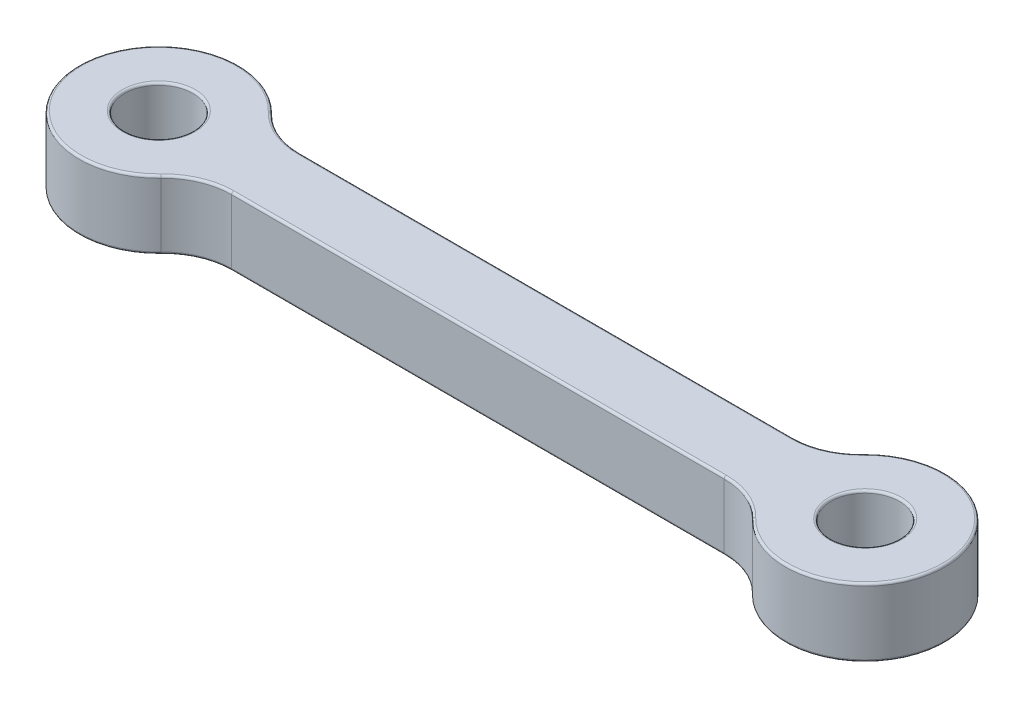
ISO-10303-21;
HEADER;
FILE_DESCRIPTION(('STEP AP214'),'2;1');
FILE_NAME('part.step','',(''),(''),'','','');
FILE_SCHEMA(('AUTOMOTIVE_DESIGN { 1 0 10303 214 1 1 1 1 }'));
ENDSEC;
DATA;
#1=APPLICATION_CONTEXT('core data for automotive mechanical design processes');
#2=APPLICATION_PROTOCOL_DEFINITION('international standard','automotive_design',2000,#1);
#3=PRODUCT_CONTEXT('',#1,'mechanical');
#4=PRODUCT('Part','Part','',(#3));
#5=PRODUCT_RELATED_PRODUCT_CATEGORY('part','',(#4));
#6=PRODUCT_DEFINITION_FORMATION('','',#4);
#7=PRODUCT_DEFINITION_CONTEXT('part definition',#1,'design');
#8=PRODUCT_DEFINITION('design','',#6,#7);
#9=PRODUCT_DEFINITION_SHAPE('','',#8);
#10=(LENGTH_UNIT() NAMED_UNIT(*) SI_UNIT(.MILLI.,.METRE.));
#11=(NAMED_UNIT(*) PLANE_ANGLE_UNIT() SI_UNIT($,.RADIAN.));
#12=(NAMED_UNIT(*) SI_UNIT($,.STERADIAN.) SOLID_ANGLE_UNIT());
#13=UNCERTAINTY_MEASURE_WITH_UNIT(LENGTH_MEASURE(1.E-05),#10,'distance_accuracy_value','');
#14=(GEOMETRIC_REPRESENTATION_CONTEXT(3) GLOBAL_UNCERTAINTY_ASSIGNED_CONTEXT((#13)) GLOBAL_UNIT_ASSIGNED_CONTEXT((#10,
#11,#12)) REPRESENTATION_CONTEXT('',''));
#15=CARTESIAN_POINT('',(0.,0.,0.));
#16=DIRECTION('',(0.,0.,1.));
#17=DIRECTION('',(1.,0.,0.));
#18=AXIS2_PLACEMENT_3D('',#15,#16,#17);
#19=CARTESIAN_POINT('',(0.,3.,-1.5));
#20=DIRECTION('',(0.,0.,-1.));
#21=DIRECTION('',(-1.,0.,0.));
#22=AXIS2_PLACEMENT_3D('',#19,#20,#21);
#23=PLANE('',#22);
#24=DIRECTION('',(0.,-1.,0.));
#25=VECTOR('',#24,1.);
#26=CARTESIAN_POINT('',(26.3095842401766,3.,-1.5));
#27=LINE('',#26,#25);
#28=CARTESIAN_POINT('',(26.3095842401766,2.9,-1.5));
#29=VERTEX_POINT('',#28);
#30=CARTESIAN_POINT('',(26.3095842401766,0.0999999999999998,-1.5));
#31=VERTEX_POINT('',#30);
#32=EDGE_CURVE('E297',#29,#31,#27,.T.);
#33=ORIENTED_EDGE('',*,*,#32,.T.);
#34=DIRECTION('',(1.,0.,0.));
#35=VECTOR('',#34,1.);
#36=CARTESIAN_POINT('',(4.69041575982343,0.1,-1.5));
#37=LINE('',#36,#35);
#38=CARTESIAN_POINT('',(4.69041575982343,0.0999999999999998,-1.5));
#39=VERTEX_POINT('',#38);
#40=EDGE_CURVE('E244',#31,#39,#37,.F.);
#41=ORIENTED_EDGE('',*,*,#40,.T.);
#42=DIRECTION('',(0.,-1.,0.));
#43=VECTOR('',#42,1.);
#44=CARTESIAN_POINT('',(4.69041575982343,3.,-1.5));
#45=LINE('',#44,#43);
#46=CARTESIAN_POINT('',(4.69041575982343,2.9,-1.5));
#47=VERTEX_POINT('',#46);
#48=EDGE_CURVE('E177',#47,#39,#45,.T.);
#49=ORIENTED_EDGE('',*,*,#48,.F.);
#50=DIRECTION('',(1.,0.,0.));
#51=VECTOR('',#50,1.);
#52=CARTESIAN_POINT('',(0.,2.9,-1.5));
#53=LINE('',#52,#51);
#54=EDGE_CURVE('E242',#47,#29,#53,.T.);
#55=ORIENTED_EDGE('',*,*,#54,.T.);
#56=EDGE_LOOP('',(#33,#41,#49,#55));
#57=FACE_BOUND('',#56,.T.);
#58=ADVANCED_FACE('F41',(#57),#23,.T.);
#59=CARTESIAN_POINT('',(4.69041575982343,3.,-4.5));
#60=DIRECTION('',(0.,-1.,0.));
#61=DIRECTION('',(0.,0.,-1.));
#62=AXIS2_PLACEMENT_3D('',#59,#60,#61);
#63=CYLINDRICAL_SURFACE('',#62,3.);
#64=ORIENTED_EDGE('',*,*,#48,.T.);
#65=CARTESIAN_POINT('',(4.69041575982343,0.0999999999999998,-4.5));
#66=DIRECTION('',(0.,1.,0.));
#67=DIRECTION('',(0.,0.,1.));
#68=AXIS2_PLACEMENT_3D('',#65,#66,#67);
#69=CIRCLE('',#68,3.);
#70=CARTESIAN_POINT('',(2.52560848605877,0.0999999999999998,-2.42307692307692));
#71=VERTEX_POINT('',#70);
#72=EDGE_CURVE('E176',#39,#71,#69,.F.);
#73=ORIENTED_EDGE('',*,*,#72,.T.);
#74=DIRECTION('',(0.,-1.,0.));
#75=VECTOR('',#74,1.);
#76=CARTESIAN_POINT('',(2.52560848605877,3.,-2.42307692307692));
#77=LINE('',#76,#75);
#78=CARTESIAN_POINT('',(2.52560848605877,2.9,-2.42307692307692));
#79=VERTEX_POINT('',#78);
#80=EDGE_CURVE('E158',#79,#71,#77,.T.);
#81=ORIENTED_EDGE('',*,*,#80,.F.);
#82=CARTESIAN_POINT('',(4.69041575982343,2.9,-4.5));
#83=DIRECTION('',(0.,1.,0.));
#84=DIRECTION('',(0.,0.,1.));
#85=AXIS2_PLACEMENT_3D('',#82,#83,#84);
#86=CIRCLE('',#85,3.);
#87=EDGE_CURVE('E173',#79,#47,#86,.T.);
#88=ORIENTED_EDGE('',*,*,#87,.T.);
#89=EDGE_LOOP('',(#64,#73,#81,#88));
#90=FACE_BOUND('',#89,.T.);
#91=ADVANCED_FACE('F171',(#90),#63,.F.);
#92=CARTESIAN_POINT('',(0.,3.,0.));
#93=DIRECTION('',(0.,-1.,0.));
#94=DIRECTION('',(0.,0.,-1.));
#95=AXIS2_PLACEMENT_3D('',#92,#93,#94);
#96=CYLINDRICAL_SURFACE('',#95,3.5);
#97=ORIENTED_EDGE('',*,*,#80,.T.);
#98=CARTESIAN_POINT('',(0.,0.0999999999999998,0.));
#99=DIRECTION('',(0.,1.,0.));
#100=DIRECTION('',(0.,0.,1.));
#101=AXIS2_PLACEMENT_3D('',#98,#99,#100);
#102=CIRCLE('',#101,3.5);
#103=CARTESIAN_POINT('',(2.52560848605877,0.0999999999999998,2.42307692307692));
#104=VERTEX_POINT('',#103);
#105=EDGE_CURVE('E165',#71,#104,#102,.T.);
#106=ORIENTED_EDGE('',*,*,#105,.T.);
#107=DIRECTION('',(0.,-1.,0.));
#108=VECTOR('',#107,1.);
#109=CARTESIAN_POINT('',(2.52560848605877,3.,2.42307692307692));
#110=LINE('',#109,#108);
#111=CARTESIAN_POINT('',(2.52560848605877,2.9,2.42307692307692));
#112=VERTEX_POINT('',#111);
#113=EDGE_CURVE('E160',#112,#104,#110,.T.);
#114=ORIENTED_EDGE('',*,*,#113,.F.);
#115=CARTESIAN_POINT('',(0.,2.9,0.));
#116=DIRECTION('',(0.,1.,0.));
#117=DIRECTION('',(0.,0.,1.));
#118=AXIS2_PLACEMENT_3D('',#115,#116,#117);
#119=CIRCLE('',#118,3.5);
#120=EDGE_CURVE('E155',#112,#79,#119,.F.);
#121=ORIENTED_EDGE('',*,*,#120,.T.);
#122=EDGE_LOOP('',(#97,#106,#114,#121));
#123=FACE_BOUND('',#122,.T.);
#124=ADVANCED_FACE('F157',(#123),#96,.T.);
#125=CARTESIAN_POINT('',(4.69041575982343,3.,4.5));
#126=DIRECTION('',(0.,-1.,0.));
#127=DIRECTION('',(0.,0.,-1.));
#128=AXIS2_PLACEMENT_3D('',#125,#126,#127);
#129=CYLINDRICAL_SURFACE('',#128,3.);
#130=ORIENTED_EDGE('',*,*,#113,.T.);
#131=CARTESIAN_POINT('',(4.69041575982343,0.0999999999999998,4.5));
#132=DIRECTION('',(0.,1.,0.));
#133=DIRECTION('',(0.,0.,1.));
#134=AXIS2_PLACEMENT_3D('',#131,#132,#133);
#135=CIRCLE('',#134,3.);
#136=CARTESIAN_POINT('',(4.69041575982343,0.0999999999999998,1.5));
#137=VERTEX_POINT('',#136);
#138=EDGE_CURVE('E223',#104,#137,#135,.F.);
#139=ORIENTED_EDGE('',*,*,#138,.T.);
#140=DIRECTION('',(0.,-1.,0.));
#141=VECTOR('',#140,1.);
#142=CARTESIAN_POINT('',(4.69041575982343,3.,1.5));
#143=LINE('',#142,#141);
#144=CARTESIAN_POINT('',(4.69041575982343,2.9,1.5));
#145=VERTEX_POINT('',#144);
#146=EDGE_CURVE('E343',#145,#137,#143,.T.);
#147=ORIENTED_EDGE('',*,*,#146,.F.);
#148=CARTESIAN_POINT('',(4.69041575982343,2.9,4.5));
#149=DIRECTION('',(0.,1.,0.));
#150=DIRECTION('',(0.,0.,1.));
#151=AXIS2_PLACEMENT_3D('',#148,#149,#150);
#152=CIRCLE('',#151,3.);
#153=EDGE_CURVE('E221',#145,#112,#152,.T.);
#154=ORIENTED_EDGE('',*,*,#153,.T.);
#155=EDGE_LOOP('',(#130,#139,#147,#154));
#156=FACE_BOUND('',#155,.T.);
#157=ADVANCED_FACE('F348',(#156),#129,.F.);
#158=CARTESIAN_POINT('',(0.,3.,1.5));
#159=DIRECTION('',(0.,0.,-1.));
#160=DIRECTION('',(-1.,0.,0.));
#161=AXIS2_PLACEMENT_3D('',#158,#159,#160);
#162=PLANE('',#161);
#163=ORIENTED_EDGE('',*,*,#146,.T.);
#164=DIRECTION('',(1.,0.,0.));
#165=VECTOR('',#164,1.);
#166=CARTESIAN_POINT('',(0.,0.0999999999999998,1.5));
#167=LINE('',#166,#165);
#168=CARTESIAN_POINT('',(26.3095842401766,0.0999999999999998,1.5));
#169=VERTEX_POINT('',#168);
#170=EDGE_CURVE('E227',#137,#169,#167,.T.);
#171=ORIENTED_EDGE('',*,*,#170,.T.);
#172=DIRECTION('',(0.,-1.,0.));
#173=VECTOR('',#172,1.);
#174=CARTESIAN_POINT('',(26.3095842401766,3.,1.5));
#175=LINE('',#174,#173);
#176=CARTESIAN_POINT('',(26.3095842401766,2.9,1.5));
#177=VERTEX_POINT('',#176);
#178=EDGE_CURVE('E340',#177,#169,#175,.T.);
#179=ORIENTED_EDGE('',*,*,#178,.F.);
#180=DIRECTION('',(1.,0.,0.));
#181=VECTOR('',#180,1.);
#182=CARTESIAN_POINT('',(4.69041575982343,2.9,1.5));
#183=LINE('',#182,#181);
#184=EDGE_CURVE('E225',#177,#145,#183,.F.);
#185=ORIENTED_EDGE('',*,*,#184,.T.);
#186=EDGE_LOOP('',(#163,#171,#179,#185));
#187=FACE_BOUND('',#186,.T.);
#188=ADVANCED_FACE('F391',(#187),#162,.F.);
#189=CARTESIAN_POINT('',(26.3095842401766,3.,4.5));
#190=DIRECTION('',(0.,-1.,0.));
#191=DIRECTION('',(0.,0.,-1.));
#192=AXIS2_PLACEMENT_3D('',#189,#190,#191);
#193=CYLINDRICAL_SURFACE('',#192,3.);
#194=ORIENTED_EDGE('',*,*,#178,.T.);
#195=CARTESIAN_POINT('',(26.3095842401766,0.0999999999999998,4.5));
#196=DIRECTION('',(0.,1.,0.));
#197=DIRECTION('',(0.,0.,1.));
#198=AXIS2_PLACEMENT_3D('',#195,#196,#197);
#199=CIRCLE('',#198,3.);
#200=CARTESIAN_POINT('',(28.4743915139412,0.0999999999999998,2.42307692307692));
#201=VERTEX_POINT('',#200);
#202=EDGE_CURVE('E231',#169,#201,#199,.F.);
#203=ORIENTED_EDGE('',*,*,#202,.T.);
#204=DIRECTION('',(0.,-1.,0.));
#205=VECTOR('',#204,1.);
#206=CARTESIAN_POINT('',(28.4743915139412,3.,2.42307692307692));
#207=LINE('',#206,#205);
#208=CARTESIAN_POINT('',(28.4743915139412,2.9,2.42307692307692));
#209=VERTEX_POINT('',#208);
#210=EDGE_CURVE('E335',#209,#201,#207,.T.);
#211=ORIENTED_EDGE('',*,*,#210,.F.);
#212=CARTESIAN_POINT('',(26.3095842401766,2.9,4.5));
#213=DIRECTION('',(0.,1.,0.));
#214=DIRECTION('',(0.,0.,1.));
#215=AXIS2_PLACEMENT_3D('',#212,#213,#214);
#216=CIRCLE('',#215,3.);
#217=EDGE_CURVE('E229',#209,#177,#216,.T.);
#218=ORIENTED_EDGE('',*,*,#217,.T.);
#219=EDGE_LOOP('',(#194,#203,#211,#218));
#220=FACE_BOUND('',#219,.T.);
#221=ADVANCED_FACE('F393',(#220),#193,.F.);
#222=CARTESIAN_POINT('',(31.,3.,0.));
#223=DIRECTION('',(0.,-1.,0.));
#224=DIRECTION('',(0.,0.,-1.));
#225=AXIS2_PLACEMENT_3D('',#222,#223,#224);
#226=CYLINDRICAL_SURFACE('',#225,3.5);
#227=ORIENTED_EDGE('',*,*,#210,.T.);
#228=CARTESIAN_POINT('',(31.,0.0999999999999998,0.));
#229=DIRECTION('',(0.,1.,0.));
#230=DIRECTION('',(0.,0.,1.));
#231=AXIS2_PLACEMENT_3D('',#228,#229,#230);
#232=CIRCLE('',#231,3.5);
#233=CARTESIAN_POINT('',(28.4743915139412,0.0999999999999998,-2.42307692307692));
#234=VERTEX_POINT('',#233);
#235=EDGE_CURVE('E235',#201,#234,#232,.T.);
#236=ORIENTED_EDGE('',*,*,#235,.T.);
#237=DIRECTION('',(0.,-1.,0.));
#238=VECTOR('',#237,1.);
#239=CARTESIAN_POINT('',(28.4743915139412,3.,-2.42307692307692));
#240=LINE('',#239,#238);
#241=CARTESIAN_POINT('',(28.4743915139412,2.9,-2.42307692307692));
#242=VERTEX_POINT('',#241);
#243=EDGE_CURVE('E333',#242,#234,#240,.T.);
#244=ORIENTED_EDGE('',*,*,#243,.F.);
#245=CARTESIAN_POINT('',(31.,2.9,0.));
#246=DIRECTION('',(0.,1.,0.));
#247=DIRECTION('',(0.,0.,1.));
#248=AXIS2_PLACEMENT_3D('',#245,#246,#247);
#249=CIRCLE('',#248,3.5);
#250=EDGE_CURVE('E233',#242,#209,#249,.F.);
#251=ORIENTED_EDGE('',*,*,#250,.T.);
#252=EDGE_LOOP('',(#227,#236,#244,#251));
#253=FACE_BOUND('',#252,.T.);
#254=ADVANCED_FACE('F426',(#253),#226,.T.);
#255=CARTESIAN_POINT('',(31.,3.,0.));
#256=DIRECTION('',(0.,-1.,0.));
#257=DIRECTION('',(0.,0.,-1.));
#258=AXIS2_PLACEMENT_3D('',#255,#256,#257);
#259=CYLINDRICAL_SURFACE('',#258,1.5);
#260=CARTESIAN_POINT('',(31.,0.0999999999999998,0.));
#261=DIRECTION('',(0.,1.,0.));
#262=DIRECTION('',(0.,0.,1.));
#263=AXIS2_PLACEMENT_3D('',#260,#261,#262);
#264=CIRCLE('',#263,1.5);
#265=CARTESIAN_POINT('',(31.,0.0999999999999998,1.5));
#266=VERTEX_POINT('',#265);
#267=EDGE_CURVE('E249',#266,#266,#264,.F.);
#268=ORIENTED_EDGE('',*,*,#267,.T.);
#269=EDGE_LOOP('',(#268));
#270=FACE_BOUND('',#269,.T.);
#271=CARTESIAN_POINT('',(31.,2.9,0.));
#272=DIRECTION('',(0.,1.,0.));
#273=DIRECTION('',(0.,0.,1.));
#274=AXIS2_PLACEMENT_3D('',#271,#272,#273);
#275=CIRCLE('',#274,1.5);
#276=CARTESIAN_POINT('',(31.,2.9,1.5));
#277=VERTEX_POINT('',#276);
#278=EDGE_CURVE('E246',#277,#277,#275,.T.);
#279=ORIENTED_EDGE('',*,*,#278,.T.);
#280=EDGE_LOOP('',(#279));
#281=FACE_BOUND('',#280,.T.);
#282=ADVANCED_FACE('F422',(#270,#281),#259,.F.);
#283=CARTESIAN_POINT('',(0.,3.,0.));
#284=DIRECTION('',(0.,-1.,0.));
#285=DIRECTION('',(0.,0.,-1.));
#286=AXIS2_PLACEMENT_3D('',#283,#284,#285);
#287=CYLINDRICAL_SURFACE('',#286,1.5);
#288=CARTESIAN_POINT('',(0.,0.0999999999999998,0.));
#289=DIRECTION('',(0.,1.,0.));
#290=DIRECTION('',(0.,0.,1.));
#291=AXIS2_PLACEMENT_3D('',#288,#289,#290);
#292=CIRCLE('',#291,1.5);
#293=CARTESIAN_POINT('',(0.,0.0999999999999998,1.5));
#294=VERTEX_POINT('',#293);
#295=EDGE_CURVE('E255',#294,#294,#292,.F.);
#296=ORIENTED_EDGE('',*,*,#295,.T.);
#297=EDGE_LOOP('',(#296));
#298=FACE_BOUND('',#297,.T.);
#299=CARTESIAN_POINT('',(0.,2.9,0.));
#300=DIRECTION('',(0.,1.,0.));
#301=DIRECTION('',(0.,0.,1.));
#302=AXIS2_PLACEMENT_3D('',#299,#300,#301);
#303=CIRCLE('',#302,1.5);
#304=CARTESIAN_POINT('',(0.,2.9,1.5));
#305=VERTEX_POINT('',#304);
#306=EDGE_CURVE('E252',#305,#305,#303,.T.);
#307=ORIENTED_EDGE('',*,*,#306,.T.);
#308=EDGE_LOOP('',(#307));
#309=FACE_BOUND('',#308,.T.);
#310=ADVANCED_FACE('F425',(#298,#309),#287,.F.);
#311=CARTESIAN_POINT('',(26.3095842401766,3.,-4.5));
#312=DIRECTION('',(0.,-1.,0.));
#313=DIRECTION('',(0.,0.,-1.));
#314=AXIS2_PLACEMENT_3D('',#311,#312,#313);
#315=CYLINDRICAL_SURFACE('',#314,3.);
#316=ORIENTED_EDGE('',*,*,#243,.T.);
#317=CARTESIAN_POINT('',(26.3095842401766,0.0999999999999998,-4.5));
#318=DIRECTION('',(0.,1.,0.));
#319=DIRECTION('',(0.,0.,1.));
#320=AXIS2_PLACEMENT_3D('',#317,#318,#319);
#321=CIRCLE('',#320,3.);
#322=EDGE_CURVE('E240',#234,#31,#321,.F.);
#323=ORIENTED_EDGE('',*,*,#322,.T.);
#324=ORIENTED_EDGE('',*,*,#32,.F.);
#325=CARTESIAN_POINT('',(26.3095842401766,2.9,-4.5));
#326=DIRECTION('',(0.,1.,0.));
#327=DIRECTION('',(0.,0.,1.));
#328=AXIS2_PLACEMENT_3D('',#325,#326,#327);
#329=CIRCLE('',#328,3.);
#330=EDGE_CURVE('E237',#29,#242,#329,.T.);
#331=ORIENTED_EDGE('',*,*,#330,.T.);
#332=EDGE_LOOP('',(#316,#323,#324,#331));
#333=FACE_BOUND('',#332,.T.);
#334=ADVANCED_FACE('F330',(#333),#315,.F.);
#335=CARTESIAN_POINT('',(0.,3.,0.));
#336=DIRECTION('',(0.,1.,0.));
#337=DIRECTION('',(0.,0.,1.));
#338=AXIS2_PLACEMENT_3D('',#335,#336,#337);
#339=PLANE('',#338);
#340=CARTESIAN_POINT('',(31.,3.,0.));
#341=DIRECTION('',(0.,1.,0.));
#342=DIRECTION('',(0.,0.,1.));
#343=AXIS2_PLACEMENT_3D('',#340,#341,#342);
#344=CIRCLE('',#343,3.4);
#345=CARTESIAN_POINT('',(28.5465517564001,3.,2.35384615384616));
#346=VERTEX_POINT('',#345);
#347=CARTESIAN_POINT('',(28.5465517564001,3.,-2.35384615384616));
#348=VERTEX_POINT('',#347);
#349=EDGE_CURVE('E50',#346,#348,#344,.T.);
#350=ORIENTED_EDGE('',*,*,#349,.T.);
#351=CARTESIAN_POINT('',(26.3095842401766,3.,-4.5));
#352=DIRECTION('',(0.,1.,0.));
#353=DIRECTION('',(0.,0.,1.));
#354=AXIS2_PLACEMENT_3D('',#351,#352,#353);
#355=CIRCLE('',#354,3.1);
#356=CARTESIAN_POINT('',(26.3095842401766,3.,-1.4));
#357=VERTEX_POINT('',#356);
#358=EDGE_CURVE('E11',#348,#357,#355,.F.);
#359=ORIENTED_EDGE('',*,*,#358,.T.);
#360=DIRECTION('',(1.,0.,0.));
#361=VECTOR('',#360,1.);
#362=CARTESIAN_POINT('',(0.,3.,-1.4));
#363=LINE('',#362,#361);
#364=CARTESIAN_POINT('',(4.69041575982343,3.,-1.4));
#365=VERTEX_POINT('',#364);
#366=EDGE_CURVE('E264',#357,#365,#363,.F.);
#367=ORIENTED_EDGE('',*,*,#366,.T.);
#368=CARTESIAN_POINT('',(4.69041575982343,3.,-4.5));
#369=DIRECTION('',(0.,1.,0.));
#370=DIRECTION('',(0.,0.,1.));
#371=AXIS2_PLACEMENT_3D('',#368,#369,#370);
#372=CIRCLE('',#371,3.1);
#373=CARTESIAN_POINT('',(2.45344824359995,3.,-2.35384615384615));
#374=VERTEX_POINT('',#373);
#375=EDGE_CURVE('E266',#365,#374,#372,.F.);
#376=ORIENTED_EDGE('',*,*,#375,.T.);
#377=CARTESIAN_POINT('',(0.,3.,0.));
#378=DIRECTION('',(0.,1.,0.));
#379=DIRECTION('',(0.,0.,1.));
#380=AXIS2_PLACEMENT_3D('',#377,#378,#379);
#381=CIRCLE('',#380,3.4);
#382=CARTESIAN_POINT('',(2.45344824359995,3.,2.35384615384615));
#383=VERTEX_POINT('',#382);
#384=EDGE_CURVE('E183',#374,#383,#381,.T.);
#385=ORIENTED_EDGE('',*,*,#384,.T.);
#386=CARTESIAN_POINT('',(4.69041575982343,3.,4.5));
#387=DIRECTION('',(0.,1.,0.));
#388=DIRECTION('',(0.,0.,1.));
#389=AXIS2_PLACEMENT_3D('',#386,#387,#388);
#390=CIRCLE('',#389,3.1);
#391=CARTESIAN_POINT('',(4.69041575982343,3.,1.4));
#392=VERTEX_POINT('',#391);
#393=EDGE_CURVE('E269',#383,#392,#390,.F.);
#394=ORIENTED_EDGE('',*,*,#393,.T.);
#395=DIRECTION('',(1.,0.,0.));
#396=VECTOR('',#395,1.);
#397=CARTESIAN_POINT('',(26.3095842401766,3.,1.4));
#398=LINE('',#397,#396);
#399=CARTESIAN_POINT('',(26.3095842401766,3.,1.4));
#400=VERTEX_POINT('',#399);
#401=EDGE_CURVE('E271',#392,#400,#398,.T.);
#402=ORIENTED_EDGE('',*,*,#401,.T.);
#403=CARTESIAN_POINT('',(26.3095842401766,3.,4.5));
#404=DIRECTION('',(0.,1.,0.));
#405=DIRECTION('',(0.,0.,1.));
#406=AXIS2_PLACEMENT_3D('',#403,#404,#405);
#407=CIRCLE('',#406,3.1);
#408=EDGE_CURVE('E61',#400,#346,#407,.F.);
#409=ORIENTED_EDGE('',*,*,#408,.T.);
#410=EDGE_LOOP('',(#350,#359,#367,#376,#385,#394,#402,#409));
#411=FACE_BOUND('',#410,.T.);
#412=CARTESIAN_POINT('',(31.,3.,0.));
#413=DIRECTION('',(0.,1.,0.));
#414=DIRECTION('',(0.,0.,1.));
#415=AXIS2_PLACEMENT_3D('',#412,#413,#414);
#416=CIRCLE('',#415,1.6);
#417=CARTESIAN_POINT('',(31.,3.,1.6));
#418=VERTEX_POINT('',#417);
#419=EDGE_CURVE('E261',#418,#418,#416,.F.);
#420=ORIENTED_EDGE('',*,*,#419,.T.);
#421=EDGE_LOOP('',(#420));
#422=FACE_BOUND('',#421,.T.);
#423=CARTESIAN_POINT('',(0.,3.,0.));
#424=DIRECTION('',(0.,1.,0.));
#425=DIRECTION('',(0.,0.,1.));
#426=AXIS2_PLACEMENT_3D('',#423,#424,#425);
#427=CIRCLE('',#426,1.6);
#428=CARTESIAN_POINT('',(0.,3.,1.6));
#429=VERTEX_POINT('',#428);
#430=EDGE_CURVE('E258',#429,#429,#427,.F.);
#431=ORIENTED_EDGE('',*,*,#430,.T.);
#432=EDGE_LOOP('',(#431));
#433=FACE_BOUND('',#432,.T.);
#434=ADVANCED_FACE('F316',(#411,#422,#433),#339,.T.);
#435=CARTESIAN_POINT('',(0.,0.,0.));
#436=DIRECTION('',(0.,1.,0.));
#437=DIRECTION('',(0.,0.,1.));
#438=AXIS2_PLACEMENT_3D('',#435,#436,#437);
#439=PLANE('',#438);
#440=CARTESIAN_POINT('',(0.,0.,0.));
#441=DIRECTION('',(0.,1.,0.));
#442=DIRECTION('',(0.,0.,1.));
#443=AXIS2_PLACEMENT_3D('',#440,#441,#442);
#444=CIRCLE('',#443,3.4);
#445=CARTESIAN_POINT('',(2.45344824359995,0.,2.35384615384615));
#446=VERTEX_POINT('',#445);
#447=CARTESIAN_POINT('',(2.45344824359995,0.,-2.35384615384615));
#448=VERTEX_POINT('',#447);
#449=EDGE_CURVE('E216',#446,#448,#444,.F.);
#450=ORIENTED_EDGE('',*,*,#449,.T.);
#451=CARTESIAN_POINT('',(4.69041575982343,0.,-4.5));
#452=DIRECTION('',(0.,1.,0.));
#453=DIRECTION('',(0.,0.,1.));
#454=AXIS2_PLACEMENT_3D('',#451,#452,#453);
#455=CIRCLE('',#454,3.1);
#456=CARTESIAN_POINT('',(4.69041575982343,0.,-1.4));
#457=VERTEX_POINT('',#456);
#458=EDGE_CURVE('E166',#448,#457,#455,.T.);
#459=ORIENTED_EDGE('',*,*,#458,.T.);
#460=DIRECTION('',(1.,0.,0.));
#461=VECTOR('',#460,1.);
#462=CARTESIAN_POINT('',(26.3095842401766,0.,-1.4));
#463=LINE('',#462,#461);
#464=CARTESIAN_POINT('',(26.3095842401766,0.,-1.4));
#465=VERTEX_POINT('',#464);
#466=EDGE_CURVE('E204',#457,#465,#463,.T.);
#467=ORIENTED_EDGE('',*,*,#466,.T.);
#468=CARTESIAN_POINT('',(26.3095842401766,0.,-4.5));
#469=DIRECTION('',(0.,1.,0.));
#470=DIRECTION('',(0.,0.,1.));
#471=AXIS2_PLACEMENT_3D('',#468,#469,#470);
#472=CIRCLE('',#471,3.1);
#473=CARTESIAN_POINT('',(28.5465517564001,0.,-2.35384615384616));
#474=VERTEX_POINT('',#473);
#475=EDGE_CURVE('E206',#465,#474,#472,.T.);
#476=ORIENTED_EDGE('',*,*,#475,.T.);
#477=CARTESIAN_POINT('',(31.,0.,0.));
#478=DIRECTION('',(0.,1.,0.));
#479=DIRECTION('',(0.,0.,1.));
#480=AXIS2_PLACEMENT_3D('',#477,#478,#479);
#481=CIRCLE('',#480,3.4);
#482=CARTESIAN_POINT('',(28.5465517564001,0.,2.35384615384616));
#483=VERTEX_POINT('',#482);
#484=EDGE_CURVE('E208',#474,#483,#481,.F.);
#485=ORIENTED_EDGE('',*,*,#484,.T.);
#486=CARTESIAN_POINT('',(26.3095842401766,0.,4.5));
#487=DIRECTION('',(0.,1.,0.));
#488=DIRECTION('',(0.,0.,1.));
#489=AXIS2_PLACEMENT_3D('',#486,#487,#488);
#490=CIRCLE('',#489,3.1);
#491=CARTESIAN_POINT('',(26.3095842401766,0.,1.4));
#492=VERTEX_POINT('',#491);
#493=EDGE_CURVE('E210',#483,#492,#490,.T.);
#494=ORIENTED_EDGE('',*,*,#493,.T.);
#495=DIRECTION('',(1.,0.,0.));
#496=VECTOR('',#495,1.);
#497=CARTESIAN_POINT('',(0.,0.,1.4));
#498=LINE('',#497,#496);
#499=CARTESIAN_POINT('',(4.69041575982343,0.,1.4));
#500=VERTEX_POINT('',#499);
#501=EDGE_CURVE('E212',#492,#500,#498,.F.);
#502=ORIENTED_EDGE('',*,*,#501,.T.);
#503=CARTESIAN_POINT('',(4.69041575982343,0.,4.5));
#504=DIRECTION('',(0.,1.,0.));
#505=DIRECTION('',(0.,0.,1.));
#506=AXIS2_PLACEMENT_3D('',#503,#504,#505);
#507=CIRCLE('',#506,3.1);
#508=EDGE_CURVE('E214',#500,#446,#507,.T.);
#509=ORIENTED_EDGE('',*,*,#508,.T.);
#510=EDGE_LOOP('',(#450,#459,#467,#476,#485,#494,#502,#509));
#511=FACE_BOUND('',#510,.T.);
#512=CARTESIAN_POINT('',(31.,0.,0.));
#513=DIRECTION('',(0.,1.,0.));
#514=DIRECTION('',(0.,0.,1.));
#515=AXIS2_PLACEMENT_3D('',#512,#513,#514);
#516=CIRCLE('',#515,1.6);
#517=CARTESIAN_POINT('',(31.,0.,1.6));
#518=VERTEX_POINT('',#517);
#519=EDGE_CURVE('E201',#518,#518,#516,.T.);
#520=ORIENTED_EDGE('',*,*,#519,.T.);
#521=EDGE_LOOP('',(#520));
#522=FACE_BOUND('',#521,.T.);
#523=CARTESIAN_POINT('',(0.,0.,0.));
#524=DIRECTION('',(0.,1.,0.));
#525=DIRECTION('',(0.,0.,1.));
#526=AXIS2_PLACEMENT_3D('',#523,#524,#525);
#527=CIRCLE('',#526,1.6);
#528=CARTESIAN_POINT('',(0.,0.,1.6));
#529=VERTEX_POINT('',#528);
#530=EDGE_CURVE('E195',#529,#529,#527,.T.);
#531=ORIENTED_EDGE('',*,*,#530,.T.);
#532=EDGE_LOOP('',(#531));
#533=FACE_BOUND('',#532,.T.);
#534=ADVANCED_FACE('F362',(#511,#522,#533),#439,.F.);
#535=CARTESIAN_POINT('',(26.3095842401766,0.0999999999999998,4.5));
#536=DIRECTION('',(0.,1.,0.));
#537=DIRECTION('',(0.,0.,1.));
#538=AXIS2_PLACEMENT_3D('',#535,#536,#537);
#539=TOROIDAL_SURFACE('',#538,3.1,0.1);
#540=CARTESIAN_POINT('',(26.3095842401766,0.1,1.4));
#541=DIRECTION('',(-1.,0.,0.));
#542=DIRECTION('',(0.,0.,1.));
#543=AXIS2_PLACEMENT_3D('',#540,#541,#542);
#544=CIRCLE('',#543,0.1);
#545=EDGE_CURVE('E291',#492,#169,#544,.T.);
#546=ORIENTED_EDGE('',*,*,#545,.F.);
#547=ORIENTED_EDGE('',*,*,#493,.F.);
#548=CARTESIAN_POINT('',(28.5465517564001,0.0999999999999998,2.35384615384615));
#549=DIRECTION('',(0.692307692307693,0.,0.72160242458822));
#550=DIRECTION('',(0.72160242458822,0.,-0.692307692307693));
#551=AXIS2_PLACEMENT_3D('',#548,#549,#550);
#552=CIRCLE('',#551,0.1);
#553=EDGE_CURVE('E294',#201,#483,#552,.T.);
#554=ORIENTED_EDGE('',*,*,#553,.F.);
#555=ORIENTED_EDGE('',*,*,#202,.F.);
#556=EDGE_LOOP('',(#546,#547,#554,#555));
#557=FACE_BOUND('',#556,.T.);
#558=ADVANCED_FACE('F383',(#557),#539,.T.);
#559=CARTESIAN_POINT('',(31.,0.0999999999999998,0.));
#560=DIRECTION('',(0.,1.,0.));
#561=DIRECTION('',(0.,0.,1.));
#562=AXIS2_PLACEMENT_3D('',#559,#560,#561);
#563=TOROIDAL_SURFACE('',#562,3.4,0.1);
#564=ORIENTED_EDGE('',*,*,#553,.T.);
#565=ORIENTED_EDGE('',*,*,#484,.F.);
#566=CARTESIAN_POINT('',(28.5465517564001,0.0999999999999998,-2.35384615384615));
#567=DIRECTION('',(-0.692307692307693,0.,0.72160242458822));
#568=DIRECTION('',(0.72160242458822,0.,0.692307692307693));
#569=AXIS2_PLACEMENT_3D('',#566,#567,#568);
#570=CIRCLE('',#569,0.1);
#571=EDGE_CURVE('E288',#234,#474,#570,.T.);
#572=ORIENTED_EDGE('',*,*,#571,.F.);
#573=ORIENTED_EDGE('',*,*,#235,.F.);
#574=EDGE_LOOP('',(#564,#565,#572,#573));
#575=FACE_BOUND('',#574,.T.);
#576=ADVANCED_FACE('F378',(#575),#563,.T.);
#577=CARTESIAN_POINT('',(0.,0.0999999999999998,1.4));
#578=DIRECTION('',(1.,0.,0.));
#579=DIRECTION('',(0.,0.,-1.));
#580=AXIS2_PLACEMENT_3D('',#577,#578,#579);
#581=CYLINDRICAL_SURFACE('',#580,0.1);
#582=ORIENTED_EDGE('',*,*,#545,.T.);
#583=ORIENTED_EDGE('',*,*,#170,.F.);
#584=CARTESIAN_POINT('',(4.69041575982343,0.1,1.4));
#585=DIRECTION('',(-1.,0.,0.));
#586=DIRECTION('',(0.,0.,1.));
#587=AXIS2_PLACEMENT_3D('',#584,#585,#586);
#588=CIRCLE('',#587,0.1);
#589=EDGE_CURVE('E285',#500,#137,#588,.T.);
#590=ORIENTED_EDGE('',*,*,#589,.F.);
#591=ORIENTED_EDGE('',*,*,#501,.F.);
#592=EDGE_LOOP('',(#582,#583,#590,#591));
#593=FACE_BOUND('',#592,.T.);
#594=ADVANCED_FACE('F388',(#593),#581,.T.);
#595=CARTESIAN_POINT('',(26.3095842401766,0.0999999999999998,-4.5));
#596=DIRECTION('',(0.,1.,0.));
#597=DIRECTION('',(0.,0.,1.));
#598=AXIS2_PLACEMENT_3D('',#595,#596,#597);
#599=TOROIDAL_SURFACE('',#598,3.1,0.1);
#600=ORIENTED_EDGE('',*,*,#571,.T.);
#601=ORIENTED_EDGE('',*,*,#475,.F.);
#602=CARTESIAN_POINT('',(26.3095842401766,0.0999999999999998,-1.4));
#603=DIRECTION('',(-1.,0.,0.));
#604=DIRECTION('',(0.,0.,1.));
#605=AXIS2_PLACEMENT_3D('',#602,#603,#604);
#606=CIRCLE('',#605,0.1);
#607=EDGE_CURVE('E282',#31,#465,#606,.T.);
#608=ORIENTED_EDGE('',*,*,#607,.F.);
#609=ORIENTED_EDGE('',*,*,#322,.F.);
#610=EDGE_LOOP('',(#600,#601,#608,#609));
#611=FACE_BOUND('',#610,.T.);
#612=ADVANCED_FACE('F374',(#611),#599,.T.);
#613=CARTESIAN_POINT('',(4.69041575982343,0.0999999999999998,4.5));
#614=DIRECTION('',(0.,1.,0.));
#615=DIRECTION('',(0.,0.,1.));
#616=AXIS2_PLACEMENT_3D('',#613,#614,#615);
#617=TOROIDAL_SURFACE('',#616,3.1,0.1);
#618=ORIENTED_EDGE('',*,*,#589,.T.);
#619=ORIENTED_EDGE('',*,*,#138,.F.);
#620=CARTESIAN_POINT('',(2.45344824359995,0.1,2.35384615384615));
#621=DIRECTION('',(-0.692307692307693,0.,0.72160242458822));
#622=DIRECTION('',(0.72160242458822,0.,0.692307692307693));
#623=AXIS2_PLACEMENT_3D('',#620,#621,#622);
#624=CIRCLE('',#623,0.1);
#625=EDGE_CURVE('E279',#446,#104,#624,.T.);
#626=ORIENTED_EDGE('',*,*,#625,.F.);
#627=ORIENTED_EDGE('',*,*,#508,.F.);
#628=EDGE_LOOP('',(#618,#619,#626,#627));
#629=FACE_BOUND('',#628,.T.);
#630=ADVANCED_FACE('F352',(#629),#617,.T.);
#631=CARTESIAN_POINT('',(0.,0.1,-1.4));
#632=DIRECTION('',(-1.,0.,0.));
#633=DIRECTION('',(0.,0.,1.));
#634=AXIS2_PLACEMENT_3D('',#631,#632,#633);
#635=CYLINDRICAL_SURFACE('',#634,0.1);
#636=ORIENTED_EDGE('',*,*,#607,.T.);
#637=ORIENTED_EDGE('',*,*,#466,.F.);
#638=CARTESIAN_POINT('',(4.69041575982343,0.1,-1.4));
#639=DIRECTION('',(-1.,0.,0.));
#640=DIRECTION('',(0.,0.,1.));
#641=AXIS2_PLACEMENT_3D('',#638,#639,#640);
#642=CIRCLE('',#641,0.1);
#643=EDGE_CURVE('E277',#39,#457,#642,.T.);
#644=ORIENTED_EDGE('',*,*,#643,.F.);
#645=ORIENTED_EDGE('',*,*,#40,.F.);
#646=EDGE_LOOP('',(#636,#637,#644,#645));
#647=FACE_BOUND('',#646,.T.);
#648=ADVANCED_FACE('F370',(#647),#635,.T.);
#649=CARTESIAN_POINT('',(0.,0.0999999999999998,0.));
#650=DIRECTION('',(0.,1.,0.));
#651=DIRECTION('',(0.,0.,1.));
#652=AXIS2_PLACEMENT_3D('',#649,#650,#651);
#653=TOROIDAL_SURFACE('',#652,3.4,0.1);
#654=ORIENTED_EDGE('',*,*,#625,.T.);
#655=ORIENTED_EDGE('',*,*,#105,.F.);
#656=CARTESIAN_POINT('',(2.45344824359995,0.1,-2.35384615384615));
#657=DIRECTION('',(0.692307692307693,0.,0.72160242458822));
#658=DIRECTION('',(0.72160242458822,0.,-0.692307692307693));
#659=AXIS2_PLACEMENT_3D('',#656,#657,#658);
#660=CIRCLE('',#659,0.1);
#661=EDGE_CURVE('E275',#448,#71,#660,.T.);
#662=ORIENTED_EDGE('',*,*,#661,.F.);
#663=ORIENTED_EDGE('',*,*,#449,.F.);
#664=EDGE_LOOP('',(#654,#655,#662,#663));
#665=FACE_BOUND('',#664,.T.);
#666=ADVANCED_FACE('F358',(#665),#653,.T.);
#667=CARTESIAN_POINT('',(4.69041575982343,0.0999999999999998,-4.5));
#668=DIRECTION('',(0.,1.,0.));
#669=DIRECTION('',(0.,0.,1.));
#670=AXIS2_PLACEMENT_3D('',#667,#668,#669);
#671=TOROIDAL_SURFACE('',#670,3.1,0.1);
#672=ORIENTED_EDGE('',*,*,#643,.T.);
#673=ORIENTED_EDGE('',*,*,#458,.F.);
#674=ORIENTED_EDGE('',*,*,#661,.T.);
#675=ORIENTED_EDGE('',*,*,#72,.F.);
#676=EDGE_LOOP('',(#672,#673,#674,#675));
#677=FACE_BOUND('',#676,.T.);
#678=ADVANCED_FACE('F365',(#677),#671,.T.);
#679=CARTESIAN_POINT('',(31.,0.0999999999999998,0.));
#680=DIRECTION('',(0.,1.,0.));
#681=DIRECTION('',(0.,0.,1.));
#682=AXIS2_PLACEMENT_3D('',#679,#680,#681);
#683=TOROIDAL_SURFACE('',#682,1.6,0.1);
#684=ORIENTED_EDGE('',*,*,#267,.F.);
#685=EDGE_LOOP('',(#684));
#686=FACE_BOUND('',#685,.T.);
#687=ORIENTED_EDGE('',*,*,#519,.F.);
#688=EDGE_LOOP('',(#687));
#689=FACE_BOUND('',#688,.T.);
#690=ADVANCED_FACE('F433',(#686,#689),#683,.T.);
#691=CARTESIAN_POINT('',(0.,0.0999999999999998,0.));
#692=DIRECTION('',(0.,1.,0.));
#693=DIRECTION('',(0.,0.,1.));
#694=AXIS2_PLACEMENT_3D('',#691,#692,#693);
#695=TOROIDAL_SURFACE('',#694,1.6,0.1);
#696=ORIENTED_EDGE('',*,*,#295,.F.);
#697=EDGE_LOOP('',(#696));
#698=FACE_BOUND('',#697,.T.);
#699=ORIENTED_EDGE('',*,*,#530,.F.);
#700=EDGE_LOOP('',(#699));
#701=FACE_BOUND('',#700,.T.);
#702=ADVANCED_FACE('F449',(#698,#701),#695,.T.);
#703=CARTESIAN_POINT('',(4.69041575982343,2.9,4.5));
#704=DIRECTION('',(0.,1.,0.));
#705=DIRECTION('',(0.,0.,1.));
#706=AXIS2_PLACEMENT_3D('',#703,#704,#705);
#707=TOROIDAL_SURFACE('',#706,3.1,0.1);
#708=CARTESIAN_POINT('',(4.69041575982343,2.9,1.4));
#709=DIRECTION('',(1.,0.,0.));
#710=DIRECTION('',(0.,0.,-1.));
#711=AXIS2_PLACEMENT_3D('',#708,#709,#710);
#712=CIRCLE('',#711,0.1);
#713=EDGE_CURVE('E186',#392,#145,#712,.T.);
#714=ORIENTED_EDGE('',*,*,#713,.F.);
#715=ORIENTED_EDGE('',*,*,#393,.F.);
#716=CARTESIAN_POINT('',(2.45344824359995,2.9,2.35384615384615));
#717=DIRECTION('',(-0.692307692307693,0.,0.72160242458822));
#718=DIRECTION('',(0.72160242458822,0.,0.692307692307693));
#719=AXIS2_PLACEMENT_3D('',#716,#717,#718);
#720=CIRCLE('',#719,0.1);
#721=EDGE_CURVE('E45',#112,#383,#720,.T.);
#722=ORIENTED_EDGE('',*,*,#721,.F.);
#723=ORIENTED_EDGE('',*,*,#153,.F.);
#724=EDGE_LOOP('',(#714,#715,#722,#723));
#725=FACE_BOUND('',#724,.T.);
#726=ADVANCED_FACE('F315',(#725),#707,.T.);
#727=CARTESIAN_POINT('',(0.,2.9,0.));
#728=DIRECTION('',(0.,1.,0.));
#729=DIRECTION('',(0.,0.,1.));
#730=AXIS2_PLACEMENT_3D('',#727,#728,#729);
#731=TOROIDAL_SURFACE('',#730,3.4,0.1);
#732=ORIENTED_EDGE('',*,*,#721,.T.);
#733=ORIENTED_EDGE('',*,*,#384,.F.);
#734=CARTESIAN_POINT('',(2.45344824359995,2.9,-2.35384615384615));
#735=DIRECTION('',(0.692307692307693,0.,0.72160242458822));
#736=DIRECTION('',(0.72160242458822,0.,-0.692307692307693));
#737=AXIS2_PLACEMENT_3D('',#734,#735,#736);
#738=CIRCLE('',#737,0.1);
#739=EDGE_CURVE('E181',#79,#374,#738,.T.);
#740=ORIENTED_EDGE('',*,*,#739,.F.);
#741=ORIENTED_EDGE('',*,*,#120,.F.);
#742=EDGE_LOOP('',(#732,#733,#740,#741));
#743=FACE_BOUND('',#742,.T.);
#744=ADVANCED_FACE('F182',(#743),#731,.T.);
#745=CARTESIAN_POINT('',(0.,2.9,1.4));
#746=DIRECTION('',(-1.,0.,0.));
#747=DIRECTION('',(0.,0.,1.));
#748=AXIS2_PLACEMENT_3D('',#745,#746,#747);
#749=CYLINDRICAL_SURFACE('',#748,0.1);
#750=ORIENTED_EDGE('',*,*,#713,.T.);
#751=ORIENTED_EDGE('',*,*,#184,.F.);
#752=CARTESIAN_POINT('',(26.3095842401766,2.9,1.4));
#753=DIRECTION('',(1.,0.,0.));
#754=DIRECTION('',(0.,0.,-1.));
#755=AXIS2_PLACEMENT_3D('',#752,#753,#754);
#756=CIRCLE('',#755,0.1);
#757=EDGE_CURVE('E187',#400,#177,#756,.T.);
#758=ORIENTED_EDGE('',*,*,#757,.F.);
#759=ORIENTED_EDGE('',*,*,#401,.F.);
#760=EDGE_LOOP('',(#750,#751,#758,#759));
#761=FACE_BOUND('',#760,.T.);
#762=ADVANCED_FACE('F566',(#761),#749,.T.);
#763=CARTESIAN_POINT('',(4.69041575982343,2.9,-4.5));
#764=DIRECTION('',(0.,1.,0.));
#765=DIRECTION('',(0.,0.,1.));
#766=AXIS2_PLACEMENT_3D('',#763,#764,#765);
#767=TOROIDAL_SURFACE('',#766,3.1,0.1);
#768=ORIENTED_EDGE('',*,*,#739,.T.);
#769=ORIENTED_EDGE('',*,*,#375,.F.);
#770=CARTESIAN_POINT('',(4.69041575982343,2.9,-1.4));
#771=DIRECTION('',(1.,0.,0.));
#772=DIRECTION('',(0.,0.,-1.));
#773=AXIS2_PLACEMENT_3D('',#770,#771,#772);
#774=CIRCLE('',#773,0.1);
#775=EDGE_CURVE('E192',#47,#365,#774,.T.);
#776=ORIENTED_EDGE('',*,*,#775,.F.);
#777=ORIENTED_EDGE('',*,*,#87,.F.);
#778=EDGE_LOOP('',(#768,#769,#776,#777));
#779=FACE_BOUND('',#778,.T.);
#780=ADVANCED_FACE('F190',(#779),#767,.T.);
#781=CARTESIAN_POINT('',(26.3095842401766,2.9,4.5));
#782=DIRECTION('',(0.,1.,0.));
#783=DIRECTION('',(0.,0.,1.));
#784=AXIS2_PLACEMENT_3D('',#781,#782,#783);
#785=TOROIDAL_SURFACE('',#784,3.1,0.1);
#786=ORIENTED_EDGE('',*,*,#757,.T.);
#787=ORIENTED_EDGE('',*,*,#217,.F.);
#788=CARTESIAN_POINT('',(28.5465517564001,2.9,2.35384615384616));
#789=DIRECTION('',(0.69230769230769,0.,0.721602424588222));
#790=DIRECTION('',(0.721602424588222,0.,-0.69230769230769));
#791=AXIS2_PLACEMENT_3D('',#788,#789,#790);
#792=CIRCLE('',#791,0.1);
#793=EDGE_CURVE('E302',#346,#209,#792,.T.);
#794=ORIENTED_EDGE('',*,*,#793,.F.);
#795=ORIENTED_EDGE('',*,*,#408,.F.);
#796=EDGE_LOOP('',(#786,#787,#794,#795));
#797=FACE_BOUND('',#796,.T.);
#798=ADVANCED_FACE('F397',(#797),#785,.T.);
#799=CARTESIAN_POINT('',(0.,2.9,-1.4));
#800=DIRECTION('',(1.,0.,0.));
#801=DIRECTION('',(0.,0.,-1.));
#802=AXIS2_PLACEMENT_3D('',#799,#800,#801);
#803=CYLINDRICAL_SURFACE('',#802,0.1);
#804=ORIENTED_EDGE('',*,*,#775,.T.);
#805=ORIENTED_EDGE('',*,*,#366,.F.);
#806=CARTESIAN_POINT('',(26.3095842401766,2.9,-1.4));
#807=DIRECTION('',(1.,0.,0.));
#808=DIRECTION('',(0.,0.,-1.));
#809=AXIS2_PLACEMENT_3D('',#806,#807,#808);
#810=CIRCLE('',#809,0.1);
#811=EDGE_CURVE('E300',#29,#357,#810,.T.);
#812=ORIENTED_EDGE('',*,*,#811,.F.);
#813=ORIENTED_EDGE('',*,*,#54,.F.);
#814=EDGE_LOOP('',(#804,#805,#812,#813));
#815=FACE_BOUND('',#814,.T.);
#816=ADVANCED_FACE('F321',(#815),#803,.T.);
#817=CARTESIAN_POINT('',(31.,2.9,0.));
#818=DIRECTION('',(0.,1.,0.));
#819=DIRECTION('',(0.,0.,1.));
#820=AXIS2_PLACEMENT_3D('',#817,#818,#819);
#821=TOROIDAL_SURFACE('',#820,3.4,0.1);
#822=ORIENTED_EDGE('',*,*,#793,.T.);
#823=ORIENTED_EDGE('',*,*,#250,.F.);
#824=CARTESIAN_POINT('',(28.5465517564001,2.9,-2.35384615384616));
#825=DIRECTION('',(-0.69230769230769,0.,0.721602424588222));
#826=DIRECTION('',(0.721602424588222,0.,0.69230769230769));
#827=AXIS2_PLACEMENT_3D('',#824,#825,#826);
#828=CIRCLE('',#827,0.1);
#829=EDGE_CURVE('E298',#348,#242,#828,.T.);
#830=ORIENTED_EDGE('',*,*,#829,.F.);
#831=ORIENTED_EDGE('',*,*,#349,.F.);
#832=EDGE_LOOP('',(#822,#823,#830,#831));
#833=FACE_BOUND('',#832,.T.);
#834=ADVANCED_FACE('F400',(#833),#821,.T.);
#835=CARTESIAN_POINT('',(26.3095842401766,2.9,-4.5));
#836=DIRECTION('',(0.,1.,0.));
#837=DIRECTION('',(0.,0.,1.));
#838=AXIS2_PLACEMENT_3D('',#835,#836,#837);
#839=TOROIDAL_SURFACE('',#838,3.1,0.1);
#840=ORIENTED_EDGE('',*,*,#811,.T.);
#841=ORIENTED_EDGE('',*,*,#358,.F.);
#842=ORIENTED_EDGE('',*,*,#829,.T.);
#843=ORIENTED_EDGE('',*,*,#330,.F.);
#844=EDGE_LOOP('',(#840,#841,#842,#843));
#845=FACE_BOUND('',#844,.T.);
#846=ADVANCED_FACE('F403',(#845),#839,.T.);
#847=CARTESIAN_POINT('',(31.,2.9,0.));
#848=DIRECTION('',(0.,1.,0.));
#849=DIRECTION('',(0.,0.,1.));
#850=AXIS2_PLACEMENT_3D('',#847,#848,#849);
#851=TOROIDAL_SURFACE('',#850,1.6,0.1);
#852=ORIENTED_EDGE('',*,*,#419,.F.);
#853=EDGE_LOOP('',(#852));
#854=FACE_BOUND('',#853,.T.);
#855=ORIENTED_EDGE('',*,*,#278,.F.);
#856=EDGE_LOOP('',(#855));
#857=FACE_BOUND('',#856,.T.);
#858=ADVANCED_FACE('F405',(#854,#857),#851,.T.);
#859=CARTESIAN_POINT('',(0.,2.9,0.));
#860=DIRECTION('',(0.,1.,0.));
#861=DIRECTION('',(0.,0.,1.));
#862=AXIS2_PLACEMENT_3D('',#859,#860,#861);
#863=TOROIDAL_SURFACE('',#862,1.6,0.1);
#864=ORIENTED_EDGE('',*,*,#430,.F.);
#865=EDGE_LOOP('',(#864));
#866=FACE_BOUND('',#865,.T.);
#867=ORIENTED_EDGE('',*,*,#306,.F.);
#868=EDGE_LOOP('',(#867));
#869=FACE_BOUND('',#868,.T.);
#870=ADVANCED_FACE('F43',(#866,#869),#863,.T.);
#871=CLOSED_SHELL('',(#58,#91,#124,#157,#188,#221,#254,#282,#310,#334,#434,#534,#558,#576,#594,
#612,#630,#648,#666,#678,#690,#702,#726,#744,#762,#780,#798,#816,#834,#846,#858,#870));
#872=MANIFOLD_SOLID_BREP('B2',#871);
#873=ADVANCED_BREP_SHAPE_REPRESENTATION('',(#18,#872),#14);
#874=SHAPE_DEFINITION_REPRESENTATION(#9,#873);
ENDSEC;
END-ISO-10303-21;
